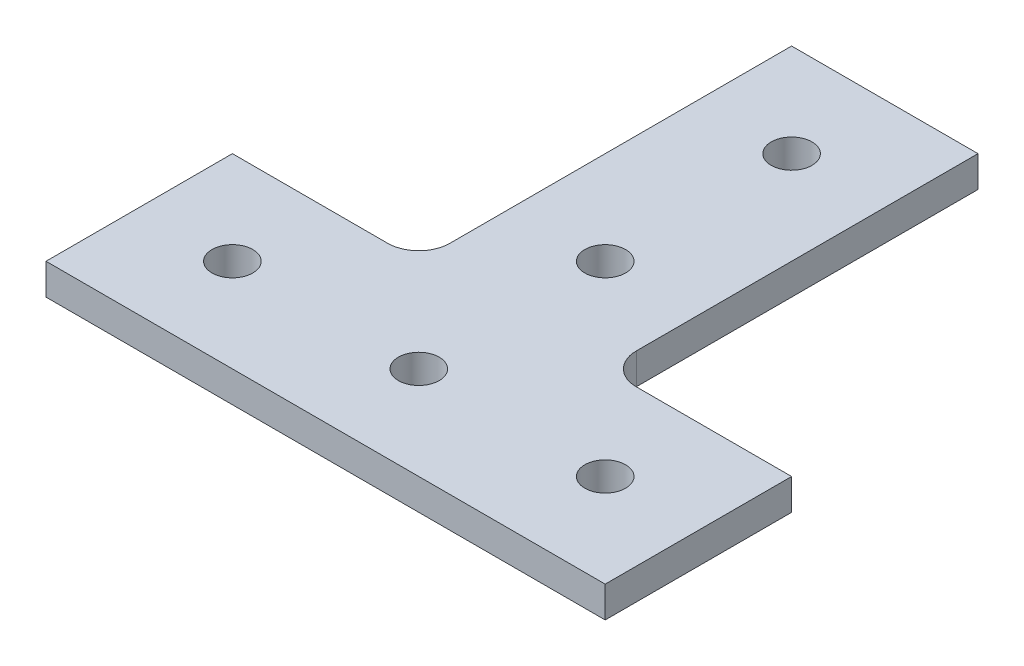
ISO-10303-21;
HEADER;
FILE_DESCRIPTION(('STEP AP214'),'2;1');
FILE_NAME('part.step','',(''),(''),'','','');
FILE_SCHEMA(('AUTOMOTIVE_DESIGN { 1 0 10303 214 1 1 1 1 }'));
ENDSEC;
DATA;
#1=APPLICATION_CONTEXT('core data for automotive mechanical design processes');
#2=APPLICATION_PROTOCOL_DEFINITION('international standard','automotive_design',2000,#1);
#3=PRODUCT_CONTEXT('',#1,'mechanical');
#4=PRODUCT('Part','Part','',(#3));
#5=PRODUCT_RELATED_PRODUCT_CATEGORY('part','',(#4));
#6=PRODUCT_DEFINITION_FORMATION('','',#4);
#7=PRODUCT_DEFINITION_CONTEXT('part definition',#1,'design');
#8=PRODUCT_DEFINITION('design','',#6,#7);
#9=PRODUCT_DEFINITION_SHAPE('','',#8);
#10=(LENGTH_UNIT() NAMED_UNIT(*) SI_UNIT(.MILLI.,.METRE.));
#11=(NAMED_UNIT(*) PLANE_ANGLE_UNIT() SI_UNIT($,.RADIAN.));
#12=(NAMED_UNIT(*) SI_UNIT($,.STERADIAN.) SOLID_ANGLE_UNIT());
#13=UNCERTAINTY_MEASURE_WITH_UNIT(LENGTH_MEASURE(1.E-05),#10,'distance_accuracy_value','');
#14=(GEOMETRIC_REPRESENTATION_CONTEXT(3) GLOBAL_UNCERTAINTY_ASSIGNED_CONTEXT((#13)) GLOBAL_UNIT_ASSIGNED_CONTEXT((#10,
#11,#12)) REPRESENTATION_CONTEXT('',''));
#15=CARTESIAN_POINT('',(0.,0.,0.));
#16=DIRECTION('',(0.,0.,1.));
#17=DIRECTION('',(1.,0.,0.));
#18=AXIS2_PLACEMENT_3D('',#15,#16,#17);
#19=CARTESIAN_POINT('',(-45.4735820895522,6.35,-26.8216417910448));
#20=DIRECTION('',(0.,1.,0.));
#21=DIRECTION('',(0.,0.,1.));
#22=AXIS2_PLACEMENT_3D('',#19,#20,#21);
#23=PLANE('',#22);
#24=CARTESIAN_POINT('',(18.0264179104478,6.35,-1.4216417910448));
#25=DIRECTION('',(0.,1.,0.));
#26=DIRECTION('',(0.,0.,1.));
#27=AXIS2_PLACEMENT_3D('',#24,#25,#26);
#28=CIRCLE('',#27,4.1656);
#29=CARTESIAN_POINT('',(18.0264179104478,6.35,2.7439582089552));
#30=VERTEX_POINT('',#29);
#31=EDGE_CURVE('E265',#30,#30,#28,.T.);
#32=ORIENTED_EDGE('',*,*,#31,.F.);
#33=EDGE_LOOP('',(#32));
#34=FACE_BOUND('',#33,.T.);
#35=CARTESIAN_POINT('',(-20.0735820895522,6.35,-1.42164179104477));
#36=DIRECTION('',(0.,1.,0.));
#37=DIRECTION('',(0.,0.,1.));
#38=AXIS2_PLACEMENT_3D('',#35,#36,#37);
#39=CIRCLE('',#38,4.1656);
#40=CARTESIAN_POINT('',(-20.0735820895522,6.35,2.74395820895523));
#41=VERTEX_POINT('',#40);
#42=EDGE_CURVE('E249',#41,#41,#39,.T.);
#43=ORIENTED_EDGE('',*,*,#42,.F.);
#44=EDGE_LOOP('',(#43));
#45=FACE_BOUND('',#44,.T.);
#46=DIRECTION('',(1.,0.,0.));
#47=VECTOR('',#46,1.);
#48=CARTESIAN_POINT('',(37.0764179104478,6.35,17.6283582089552));
#49=LINE('',#48,#47);
#50=CARTESIAN_POINT('',(-77.2235820895522,6.35,17.6283582089552));
#51=VERTEX_POINT('',#50);
#52=CARTESIAN_POINT('',(37.0764179104478,6.35,17.6283582089552));
#53=VERTEX_POINT('',#52);
#54=EDGE_CURVE('E182',#51,#53,#49,.T.);
#55=ORIENTED_EDGE('',*,*,#54,.T.);
#56=DIRECTION('',(0.,0.,-1.));
#57=VECTOR('',#56,1.);
#58=CARTESIAN_POINT('',(37.0764179104478,6.35,-20.4716417910448));
#59=LINE('',#58,#57);
#60=CARTESIAN_POINT('',(37.0764179104478,6.35,-20.4716417910448));
#61=VERTEX_POINT('',#60);
#62=EDGE_CURVE('E106',#53,#61,#59,.T.);
#63=ORIENTED_EDGE('',*,*,#62,.T.);
#64=DIRECTION('',(-1.,0.,0.));
#65=VECTOR('',#64,1.);
#66=CARTESIAN_POINT('',(5.32641791044777,6.35,-20.4716417910448));
#67=LINE('',#66,#65);
#68=CARTESIAN_POINT('',(5.32641791044777,6.35,-20.4716417910448));
#69=VERTEX_POINT('',#68);
#70=EDGE_CURVE('E211',#61,#69,#67,.T.);
#71=ORIENTED_EDGE('',*,*,#70,.T.);
#72=CARTESIAN_POINT('',(5.32641791044777,6.35,-26.8216417910448));
#73=DIRECTION('',(0.,-1.,0.));
#74=DIRECTION('',(0.,0.,-1.));
#75=AXIS2_PLACEMENT_3D('',#72,#73,#74);
#76=CIRCLE('',#75,6.35);
#77=CARTESIAN_POINT('',(-1.02358208955223,6.35,-26.8216417910448));
#78=VERTEX_POINT('',#77);
#79=EDGE_CURVE('E231',#69,#78,#76,.T.);
#80=ORIENTED_EDGE('',*,*,#79,.T.);
#81=DIRECTION('',(0.,0.,-1.));
#82=VECTOR('',#81,1.);
#83=CARTESIAN_POINT('',(-1.02358208955224,6.35,-96.6716417910448));
#84=LINE('',#83,#82);
#85=CARTESIAN_POINT('',(-1.02358208955224,6.35,-96.6716417910448));
#86=VERTEX_POINT('',#85);
#87=EDGE_CURVE('E227',#78,#86,#84,.T.);
#88=ORIENTED_EDGE('',*,*,#87,.T.);
#89=DIRECTION('',(-1.,0.,0.));
#90=VECTOR('',#89,1.);
#91=CARTESIAN_POINT('',(-39.1235820895522,6.35,-96.6716417910448));
#92=LINE('',#91,#90);
#93=CARTESIAN_POINT('',(-39.1235820895522,6.35,-96.6716417910448));
#94=VERTEX_POINT('',#93);
#95=EDGE_CURVE('E230',#86,#94,#92,.T.);
#96=ORIENTED_EDGE('',*,*,#95,.T.);
#97=DIRECTION('',(0.,0.,1.));
#98=VECTOR('',#97,1.);
#99=CARTESIAN_POINT('',(-39.1235820895522,6.35,-26.8216417910448));
#100=LINE('',#99,#98);
#101=CARTESIAN_POINT('',(-39.1235820895522,6.35,-26.8216417910448));
#102=VERTEX_POINT('',#101);
#103=EDGE_CURVE('E131',#94,#102,#100,.T.);
#104=ORIENTED_EDGE('',*,*,#103,.T.);
#105=CARTESIAN_POINT('',(-45.4735820895522,6.35,-26.8216417910448));
#106=DIRECTION('',(0.,-1.,0.));
#107=DIRECTION('',(0.,0.,1.));
#108=AXIS2_PLACEMENT_3D('',#105,#106,#107);
#109=CIRCLE('',#108,6.35);
#110=CARTESIAN_POINT('',(-45.4735820895523,6.35,-20.4716417910448));
#111=VERTEX_POINT('',#110);
#112=EDGE_CURVE('E125',#102,#111,#109,.T.);
#113=ORIENTED_EDGE('',*,*,#112,.T.);
#114=DIRECTION('',(-1.,0.,0.));
#115=VECTOR('',#114,1.);
#116=CARTESIAN_POINT('',(-77.2235820895522,6.35,-20.4716417910448));
#117=LINE('',#116,#115);
#118=CARTESIAN_POINT('',(-77.2235820895522,6.35,-20.4716417910448));
#119=VERTEX_POINT('',#118);
#120=EDGE_CURVE('E129',#111,#119,#117,.T.);
#121=ORIENTED_EDGE('',*,*,#120,.T.);
#122=DIRECTION('',(0.,0.,1.));
#123=VECTOR('',#122,1.);
#124=CARTESIAN_POINT('',(-77.2235820895522,6.35,17.6283582089552));
#125=LINE('',#124,#123);
#126=EDGE_CURVE('E57',#119,#51,#125,.T.);
#127=ORIENTED_EDGE('',*,*,#126,.T.);
#128=EDGE_LOOP('',(#55,#63,#71,#80,#88,#96,#104,#113,#121,#127));
#129=FACE_BOUND('',#128,.T.);
#130=CARTESIAN_POINT('',(-20.0735820895522,6.35,-77.6216417910448));
#131=DIRECTION('',(0.,1.,0.));
#132=DIRECTION('',(0.,0.,1.));
#133=AXIS2_PLACEMENT_3D('',#130,#131,#132);
#134=CIRCLE('',#133,4.16560000000001);
#135=CARTESIAN_POINT('',(-20.0735820895522,6.35,-73.4560417910448));
#136=VERTEX_POINT('',#135);
#137=EDGE_CURVE('E158',#136,#136,#134,.T.);
#138=ORIENTED_EDGE('',*,*,#137,.F.);
#139=EDGE_LOOP('',(#138));
#140=FACE_BOUND('',#139,.T.);
#141=CARTESIAN_POINT('',(-20.0735820895522,6.35,-39.5216417910448));
#142=DIRECTION('',(0.,1.,0.));
#143=DIRECTION('',(0.,0.,1.));
#144=AXIS2_PLACEMENT_3D('',#141,#142,#143);
#145=CIRCLE('',#144,4.1656);
#146=CARTESIAN_POINT('',(-20.0735820895522,6.35,-35.3560417910448));
#147=VERTEX_POINT('',#146);
#148=EDGE_CURVE('E257',#147,#147,#145,.T.);
#149=ORIENTED_EDGE('',*,*,#148,.F.);
#150=EDGE_LOOP('',(#149));
#151=FACE_BOUND('',#150,.T.);
#152=CARTESIAN_POINT('',(-58.1735820895522,6.35,-1.42164179104477));
#153=DIRECTION('',(0.,1.,0.));
#154=DIRECTION('',(0.,0.,1.));
#155=AXIS2_PLACEMENT_3D('',#152,#153,#154);
#156=CIRCLE('',#155,4.1656);
#157=CARTESIAN_POINT('',(-58.1735820895522,6.35,2.74395820895523));
#158=VERTEX_POINT('',#157);
#159=EDGE_CURVE('E273',#158,#158,#156,.T.);
#160=ORIENTED_EDGE('',*,*,#159,.F.);
#161=EDGE_LOOP('',(#160));
#162=FACE_BOUND('',#161,.T.);
#163=ADVANCED_FACE('F39',(#34,#45,#129,#140,#151,#162),#23,.T.);
#164=CARTESIAN_POINT('',(-45.4735820895522,0.,-26.8216417910448));
#165=DIRECTION('',(0.,1.,0.));
#166=DIRECTION('',(0.,0.,1.));
#167=AXIS2_PLACEMENT_3D('',#164,#165,#166);
#168=PLANE('',#167);
#169=DIRECTION('',(1.,0.,0.));
#170=VECTOR('',#169,1.);
#171=CARTESIAN_POINT('',(37.0764179104478,0.,17.6283582089552));
#172=LINE('',#171,#170);
#173=CARTESIAN_POINT('',(-77.2235820895522,0.,17.6283582089552));
#174=VERTEX_POINT('',#173);
#175=CARTESIAN_POINT('',(37.0764179104478,0.,17.6283582089552));
#176=VERTEX_POINT('',#175);
#177=EDGE_CURVE('E153',#174,#176,#172,.T.);
#178=ORIENTED_EDGE('',*,*,#177,.F.);
#179=DIRECTION('',(0.,0.,1.));
#180=VECTOR('',#179,1.);
#181=CARTESIAN_POINT('',(-77.2235820895522,0.,17.6283582089552));
#182=LINE('',#181,#180);
#183=CARTESIAN_POINT('',(-77.2235820895522,0.,-20.4716417910448));
#184=VERTEX_POINT('',#183);
#185=EDGE_CURVE('E98',#184,#174,#182,.T.);
#186=ORIENTED_EDGE('',*,*,#185,.F.);
#187=DIRECTION('',(-1.,0.,0.));
#188=VECTOR('',#187,1.);
#189=CARTESIAN_POINT('',(-77.2235820895522,0.,-20.4716417910448));
#190=LINE('',#189,#188);
#191=CARTESIAN_POINT('',(-45.4735820895523,0.,-20.4716417910448));
#192=VERTEX_POINT('',#191);
#193=EDGE_CURVE('E92',#192,#184,#190,.T.);
#194=ORIENTED_EDGE('',*,*,#193,.F.);
#195=CARTESIAN_POINT('',(-45.4735820895522,0.,-26.8216417910448));
#196=DIRECTION('',(0.,-1.,0.));
#197=DIRECTION('',(0.,0.,1.));
#198=AXIS2_PLACEMENT_3D('',#195,#196,#197);
#199=CIRCLE('',#198,6.35);
#200=CARTESIAN_POINT('',(-39.1235820895522,0.,-26.8216417910448));
#201=VERTEX_POINT('',#200);
#202=EDGE_CURVE('E140',#201,#192,#199,.T.);
#203=ORIENTED_EDGE('',*,*,#202,.F.);
#204=DIRECTION('',(0.,0.,1.));
#205=VECTOR('',#204,1.);
#206=CARTESIAN_POINT('',(-39.1235820895522,0.,-26.8216417910448));
#207=LINE('',#206,#205);
#208=CARTESIAN_POINT('',(-39.1235820895522,0.,-96.6716417910448));
#209=VERTEX_POINT('',#208);
#210=EDGE_CURVE('E173',#209,#201,#207,.T.);
#211=ORIENTED_EDGE('',*,*,#210,.F.);
#212=DIRECTION('',(-1.,0.,0.));
#213=VECTOR('',#212,1.);
#214=CARTESIAN_POINT('',(-39.1235820895522,0.,-96.6716417910448));
#215=LINE('',#214,#213);
#216=CARTESIAN_POINT('',(-1.02358208955224,0.,-96.6716417910448));
#217=VERTEX_POINT('',#216);
#218=EDGE_CURVE('E170',#217,#209,#215,.T.);
#219=ORIENTED_EDGE('',*,*,#218,.F.);
#220=DIRECTION('',(0.,0.,-1.));
#221=VECTOR('',#220,1.);
#222=CARTESIAN_POINT('',(-1.02358208955224,0.,-96.6716417910448));
#223=LINE('',#222,#221);
#224=CARTESIAN_POINT('',(-1.02358208955223,0.,-26.8216417910448));
#225=VERTEX_POINT('',#224);
#226=EDGE_CURVE('E167',#225,#217,#223,.T.);
#227=ORIENTED_EDGE('',*,*,#226,.F.);
#228=CARTESIAN_POINT('',(5.32641791044777,0.,-26.8216417910448));
#229=DIRECTION('',(0.,-1.,0.));
#230=DIRECTION('',(0.,0.,-1.));
#231=AXIS2_PLACEMENT_3D('',#228,#229,#230);
#232=CIRCLE('',#231,6.35);
#233=CARTESIAN_POINT('',(5.32641791044777,0.,-20.4716417910448));
#234=VERTEX_POINT('',#233);
#235=EDGE_CURVE('E164',#234,#225,#232,.T.);
#236=ORIENTED_EDGE('',*,*,#235,.F.);
#237=DIRECTION('',(-1.,0.,0.));
#238=VECTOR('',#237,1.);
#239=CARTESIAN_POINT('',(5.32641791044777,0.,-20.4716417910448));
#240=LINE('',#239,#238);
#241=CARTESIAN_POINT('',(37.0764179104478,0.,-20.4716417910448));
#242=VERTEX_POINT('',#241);
#243=EDGE_CURVE('E161',#242,#234,#240,.T.);
#244=ORIENTED_EDGE('',*,*,#243,.F.);
#245=DIRECTION('',(0.,0.,-1.));
#246=VECTOR('',#245,1.);
#247=CARTESIAN_POINT('',(37.0764179104478,0.,-20.4716417910448));
#248=LINE('',#247,#246);
#249=EDGE_CURVE('E157',#176,#242,#248,.T.);
#250=ORIENTED_EDGE('',*,*,#249,.F.);
#251=EDGE_LOOP('',(#178,#186,#194,#203,#211,#219,#227,#236,#244,#250));
#252=FACE_BOUND('',#251,.T.);
#253=CARTESIAN_POINT('',(-20.0735820895522,0.,-77.6216417910448));
#254=DIRECTION('',(0.,1.,0.));
#255=DIRECTION('',(0.,0.,1.));
#256=AXIS2_PLACEMENT_3D('',#253,#254,#255);
#257=CIRCLE('',#256,4.16560000000001);
#258=CARTESIAN_POINT('',(-20.0735820895522,0.,-73.4560417910448));
#259=VERTEX_POINT('',#258);
#260=EDGE_CURVE('E245',#259,#259,#257,.T.);
#261=ORIENTED_EDGE('',*,*,#260,.T.);
#262=EDGE_LOOP('',(#261));
#263=FACE_BOUND('',#262,.T.);
#264=CARTESIAN_POINT('',(-20.0735820895522,0.,-1.42164179104477));
#265=DIRECTION('',(0.,1.,0.));
#266=DIRECTION('',(0.,0.,1.));
#267=AXIS2_PLACEMENT_3D('',#264,#265,#266);
#268=CIRCLE('',#267,4.1656);
#269=CARTESIAN_POINT('',(-20.0735820895522,0.,2.74395820895523));
#270=VERTEX_POINT('',#269);
#271=EDGE_CURVE('E253',#270,#270,#268,.T.);
#272=ORIENTED_EDGE('',*,*,#271,.T.);
#273=EDGE_LOOP('',(#272));
#274=FACE_BOUND('',#273,.T.);
#275=CARTESIAN_POINT('',(-20.0735820895522,0.,-39.5216417910448));
#276=DIRECTION('',(0.,1.,0.));
#277=DIRECTION('',(0.,0.,1.));
#278=AXIS2_PLACEMENT_3D('',#275,#276,#277);
#279=CIRCLE('',#278,4.1656);
#280=CARTESIAN_POINT('',(-20.0735820895522,0.,-35.3560417910448));
#281=VERTEX_POINT('',#280);
#282=EDGE_CURVE('E261',#281,#281,#279,.T.);
#283=ORIENTED_EDGE('',*,*,#282,.T.);
#284=EDGE_LOOP('',(#283));
#285=FACE_BOUND('',#284,.T.);
#286=CARTESIAN_POINT('',(18.0264179104478,0.,-1.4216417910448));
#287=DIRECTION('',(0.,1.,0.));
#288=DIRECTION('',(0.,0.,1.));
#289=AXIS2_PLACEMENT_3D('',#286,#287,#288);
#290=CIRCLE('',#289,4.1656);
#291=CARTESIAN_POINT('',(18.0264179104478,0.,2.7439582089552));
#292=VERTEX_POINT('',#291);
#293=EDGE_CURVE('E269',#292,#292,#290,.T.);
#294=ORIENTED_EDGE('',*,*,#293,.T.);
#295=EDGE_LOOP('',(#294));
#296=FACE_BOUND('',#295,.T.);
#297=CARTESIAN_POINT('',(-58.1735820895522,0.,-1.42164179104477));
#298=DIRECTION('',(0.,1.,0.));
#299=DIRECTION('',(0.,0.,1.));
#300=AXIS2_PLACEMENT_3D('',#297,#298,#299);
#301=CIRCLE('',#300,4.1656);
#302=CARTESIAN_POINT('',(-58.1735820895522,0.,2.74395820895523));
#303=VERTEX_POINT('',#302);
#304=EDGE_CURVE('E277',#303,#303,#301,.T.);
#305=ORIENTED_EDGE('',*,*,#304,.T.);
#306=EDGE_LOOP('',(#305));
#307=FACE_BOUND('',#306,.T.);
#308=ADVANCED_FACE('F215',(#252,#263,#274,#285,#296,#307),#168,.F.);
#309=CARTESIAN_POINT('',(37.0764179104478,6.35,17.6283582089552));
#310=DIRECTION('',(0.,0.,-1.));
#311=DIRECTION('',(-1.,0.,0.));
#312=AXIS2_PLACEMENT_3D('',#309,#310,#311);
#313=PLANE('',#312);
#314=ORIENTED_EDGE('',*,*,#177,.T.);
#315=DIRECTION('',(0.,-1.,0.));
#316=VECTOR('',#315,1.);
#317=CARTESIAN_POINT('',(37.0764179104478,6.35,17.6283582089552));
#318=LINE('',#317,#316);
#319=EDGE_CURVE('E11',#53,#176,#318,.T.);
#320=ORIENTED_EDGE('',*,*,#319,.F.);
#321=ORIENTED_EDGE('',*,*,#54,.F.);
#322=DIRECTION('',(0.,-1.,0.));
#323=VECTOR('',#322,1.);
#324=CARTESIAN_POINT('',(-77.2235820895522,6.35,17.6283582089552));
#325=LINE('',#324,#323);
#326=EDGE_CURVE('E149',#51,#174,#325,.T.);
#327=ORIENTED_EDGE('',*,*,#326,.T.);
#328=EDGE_LOOP('',(#314,#320,#321,#327));
#329=FACE_BOUND('',#328,.T.);
#330=ADVANCED_FACE('F41',(#329),#313,.F.);
#331=CARTESIAN_POINT('',(37.0764179104478,6.35,-20.4716417910448));
#332=DIRECTION('',(-1.,0.,0.));
#333=DIRECTION('',(0.,0.,1.));
#334=AXIS2_PLACEMENT_3D('',#331,#332,#333);
#335=PLANE('',#334);
#336=ORIENTED_EDGE('',*,*,#249,.T.);
#337=DIRECTION('',(0.,-1.,0.));
#338=VECTOR('',#337,1.);
#339=CARTESIAN_POINT('',(37.0764179104478,6.35,-20.4716417910448));
#340=LINE('',#339,#338);
#341=EDGE_CURVE('E49',#61,#242,#340,.T.);
#342=ORIENTED_EDGE('',*,*,#341,.F.);
#343=ORIENTED_EDGE('',*,*,#62,.F.);
#344=ORIENTED_EDGE('',*,*,#319,.T.);
#345=EDGE_LOOP('',(#336,#342,#343,#344));
#346=FACE_BOUND('',#345,.T.);
#347=ADVANCED_FACE('F321',(#346),#335,.F.);
#348=CARTESIAN_POINT('',(5.32641791044777,6.35,-20.4716417910448));
#349=DIRECTION('',(0.,0.,1.));
#350=DIRECTION('',(1.,0.,0.));
#351=AXIS2_PLACEMENT_3D('',#348,#349,#350);
#352=PLANE('',#351);
#353=ORIENTED_EDGE('',*,*,#243,.T.);
#354=DIRECTION('',(0.,-1.,0.));
#355=VECTOR('',#354,1.);
#356=CARTESIAN_POINT('',(5.32641791044777,6.35,-20.4716417910448));
#357=LINE('',#356,#355);
#358=EDGE_CURVE('E201',#69,#234,#357,.T.);
#359=ORIENTED_EDGE('',*,*,#358,.F.);
#360=ORIENTED_EDGE('',*,*,#70,.F.);
#361=ORIENTED_EDGE('',*,*,#341,.T.);
#362=EDGE_LOOP('',(#353,#359,#360,#361));
#363=FACE_BOUND('',#362,.T.);
#364=ADVANCED_FACE('F209',(#363),#352,.F.);
#365=CARTESIAN_POINT('',(5.32641791044777,6.35,-26.8216417910448));
#366=DIRECTION('',(0.,-1.,0.));
#367=DIRECTION('',(0.,0.,-1.));
#368=AXIS2_PLACEMENT_3D('',#365,#366,#367);
#369=CYLINDRICAL_SURFACE('',#368,6.35);
#370=ORIENTED_EDGE('',*,*,#235,.T.);
#371=DIRECTION('',(0.,-1.,0.));
#372=VECTOR('',#371,1.);
#373=CARTESIAN_POINT('',(-1.02358208955223,6.35,-26.8216417910448));
#374=LINE('',#373,#372);
#375=EDGE_CURVE('E197',#78,#225,#374,.T.);
#376=ORIENTED_EDGE('',*,*,#375,.F.);
#377=ORIENTED_EDGE('',*,*,#79,.F.);
#378=ORIENTED_EDGE('',*,*,#358,.T.);
#379=EDGE_LOOP('',(#370,#376,#377,#378));
#380=FACE_BOUND('',#379,.T.);
#381=ADVANCED_FACE('F221',(#380),#369,.F.);
#382=CARTESIAN_POINT('',(-1.02358208955224,6.35,-96.6716417910448));
#383=DIRECTION('',(-1.,0.,0.));
#384=DIRECTION('',(0.,0.,1.));
#385=AXIS2_PLACEMENT_3D('',#382,#383,#384);
#386=PLANE('',#385);
#387=ORIENTED_EDGE('',*,*,#226,.T.);
#388=DIRECTION('',(0.,-1.,0.));
#389=VECTOR('',#388,1.);
#390=CARTESIAN_POINT('',(-1.02358208955224,6.35,-96.6716417910448));
#391=LINE('',#390,#389);
#392=EDGE_CURVE('E193',#86,#217,#391,.T.);
#393=ORIENTED_EDGE('',*,*,#392,.F.);
#394=ORIENTED_EDGE('',*,*,#87,.F.);
#395=ORIENTED_EDGE('',*,*,#375,.T.);
#396=EDGE_LOOP('',(#387,#393,#394,#395));
#397=FACE_BOUND('',#396,.T.);
#398=ADVANCED_FACE('F225',(#397),#386,.F.);
#399=CARTESIAN_POINT('',(-39.1235820895522,6.35,-96.6716417910448));
#400=DIRECTION('',(0.,0.,1.));
#401=DIRECTION('',(1.,0.,0.));
#402=AXIS2_PLACEMENT_3D('',#399,#400,#401);
#403=PLANE('',#402);
#404=ORIENTED_EDGE('',*,*,#218,.T.);
#405=DIRECTION('',(0.,-1.,0.));
#406=VECTOR('',#405,1.);
#407=CARTESIAN_POINT('',(-39.1235820895522,6.35,-96.6716417910448));
#408=LINE('',#407,#406);
#409=EDGE_CURVE('E189',#94,#209,#408,.T.);
#410=ORIENTED_EDGE('',*,*,#409,.F.);
#411=ORIENTED_EDGE('',*,*,#95,.F.);
#412=ORIENTED_EDGE('',*,*,#392,.T.);
#413=EDGE_LOOP('',(#404,#410,#411,#412));
#414=FACE_BOUND('',#413,.T.);
#415=ADVANCED_FACE('F311',(#414),#403,.F.);
#416=CARTESIAN_POINT('',(-39.1235820895522,6.35,-26.8216417910448));
#417=DIRECTION('',(1.,0.,0.));
#418=DIRECTION('',(0.,0.,-1.));
#419=AXIS2_PLACEMENT_3D('',#416,#417,#418);
#420=PLANE('',#419);
#421=ORIENTED_EDGE('',*,*,#210,.T.);
#422=DIRECTION('',(0.,-1.,0.));
#423=VECTOR('',#422,1.);
#424=CARTESIAN_POINT('',(-39.1235820895522,6.35,-26.8216417910448));
#425=LINE('',#424,#423);
#426=EDGE_CURVE('E142',#102,#201,#425,.T.);
#427=ORIENTED_EDGE('',*,*,#426,.F.);
#428=ORIENTED_EDGE('',*,*,#103,.F.);
#429=ORIENTED_EDGE('',*,*,#409,.T.);
#430=EDGE_LOOP('',(#421,#427,#428,#429));
#431=FACE_BOUND('',#430,.T.);
#432=ADVANCED_FACE('F308',(#431),#420,.F.);
#433=CARTESIAN_POINT('',(-45.4735820895522,6.35,-26.8216417910448));
#434=DIRECTION('',(0.,-1.,0.));
#435=DIRECTION('',(0.,0.,-1.));
#436=AXIS2_PLACEMENT_3D('',#433,#434,#435);
#437=CYLINDRICAL_SURFACE('',#436,6.35);
#438=ORIENTED_EDGE('',*,*,#202,.T.);
#439=DIRECTION('',(0.,-1.,0.));
#440=VECTOR('',#439,1.);
#441=CARTESIAN_POINT('',(-45.4735820895523,6.35,-20.4716417910448));
#442=LINE('',#441,#440);
#443=EDGE_CURVE('E137',#111,#192,#442,.T.);
#444=ORIENTED_EDGE('',*,*,#443,.F.);
#445=ORIENTED_EDGE('',*,*,#112,.F.);
#446=ORIENTED_EDGE('',*,*,#426,.T.);
#447=EDGE_LOOP('',(#438,#444,#445,#446));
#448=FACE_BOUND('',#447,.T.);
#449=ADVANCED_FACE('F138',(#448),#437,.F.);
#450=CARTESIAN_POINT('',(-77.2235820895522,6.35,-20.4716417910448));
#451=DIRECTION('',(0.,0.,1.));
#452=DIRECTION('',(1.,0.,0.));
#453=AXIS2_PLACEMENT_3D('',#450,#451,#452);
#454=PLANE('',#453);
#455=ORIENTED_EDGE('',*,*,#193,.T.);
#456=DIRECTION('',(0.,-1.,0.));
#457=VECTOR('',#456,1.);
#458=CARTESIAN_POINT('',(-77.2235820895522,6.35,-20.4716417910448));
#459=LINE('',#458,#457);
#460=EDGE_CURVE('E143',#119,#184,#459,.T.);
#461=ORIENTED_EDGE('',*,*,#460,.F.);
#462=ORIENTED_EDGE('',*,*,#120,.F.);
#463=ORIENTED_EDGE('',*,*,#443,.T.);
#464=EDGE_LOOP('',(#455,#461,#462,#463));
#465=FACE_BOUND('',#464,.T.);
#466=ADVANCED_FACE('F145',(#465),#454,.F.);
#467=CARTESIAN_POINT('',(-77.2235820895522,6.35,17.6283582089552));
#468=DIRECTION('',(1.,0.,0.));
#469=DIRECTION('',(0.,0.,-1.));
#470=AXIS2_PLACEMENT_3D('',#467,#468,#469);
#471=PLANE('',#470);
#472=ORIENTED_EDGE('',*,*,#185,.T.);
#473=ORIENTED_EDGE('',*,*,#326,.F.);
#474=ORIENTED_EDGE('',*,*,#126,.F.);
#475=ORIENTED_EDGE('',*,*,#460,.T.);
#476=EDGE_LOOP('',(#472,#473,#474,#475));
#477=FACE_BOUND('',#476,.T.);
#478=ADVANCED_FACE('F301',(#477),#471,.F.);
#479=CARTESIAN_POINT('',(-20.0735820895522,6.35,-77.6216417910448));
#480=DIRECTION('',(0.,-1.,0.));
#481=DIRECTION('',(0.,0.,-1.));
#482=AXIS2_PLACEMENT_3D('',#479,#480,#481);
#483=CYLINDRICAL_SURFACE('',#482,4.16560000000001);
#484=ORIENTED_EDGE('',*,*,#137,.T.);
#485=EDGE_LOOP('',(#484));
#486=FACE_BOUND('',#485,.T.);
#487=ORIENTED_EDGE('',*,*,#260,.F.);
#488=EDGE_LOOP('',(#487));
#489=FACE_BOUND('',#488,.T.);
#490=ADVANCED_FACE('F298',(#486,#489),#483,.F.);
#491=CARTESIAN_POINT('',(-20.0735820895522,6.35,-1.42164179104477));
#492=DIRECTION('',(0.,-1.,0.));
#493=DIRECTION('',(0.,0.,-1.));
#494=AXIS2_PLACEMENT_3D('',#491,#492,#493);
#495=CYLINDRICAL_SURFACE('',#494,4.1656);
#496=ORIENTED_EDGE('',*,*,#42,.T.);
#497=EDGE_LOOP('',(#496));
#498=FACE_BOUND('',#497,.T.);
#499=ORIENTED_EDGE('',*,*,#271,.F.);
#500=EDGE_LOOP('',(#499));
#501=FACE_BOUND('',#500,.T.);
#502=ADVANCED_FACE('F397',(#498,#501),#495,.F.);
#503=CARTESIAN_POINT('',(-20.0735820895522,6.35,-39.5216417910448));
#504=DIRECTION('',(0.,-1.,0.));
#505=DIRECTION('',(0.,0.,-1.));
#506=AXIS2_PLACEMENT_3D('',#503,#504,#505);
#507=CYLINDRICAL_SURFACE('',#506,4.1656);
#508=ORIENTED_EDGE('',*,*,#148,.T.);
#509=EDGE_LOOP('',(#508));
#510=FACE_BOUND('',#509,.T.);
#511=ORIENTED_EDGE('',*,*,#282,.F.);
#512=EDGE_LOOP('',(#511));
#513=FACE_BOUND('',#512,.T.);
#514=ADVANCED_FACE('F405',(#510,#513),#507,.F.);
#515=CARTESIAN_POINT('',(18.0264179104478,6.35,-1.4216417910448));
#516=DIRECTION('',(0.,-1.,0.));
#517=DIRECTION('',(0.,0.,-1.));
#518=AXIS2_PLACEMENT_3D('',#515,#516,#517);
#519=CYLINDRICAL_SURFACE('',#518,4.1656);
#520=ORIENTED_EDGE('',*,*,#31,.T.);
#521=EDGE_LOOP('',(#520));
#522=FACE_BOUND('',#521,.T.);
#523=ORIENTED_EDGE('',*,*,#293,.F.);
#524=EDGE_LOOP('',(#523));
#525=FACE_BOUND('',#524,.T.);
#526=ADVANCED_FACE('F413',(#522,#525),#519,.F.);
#527=CARTESIAN_POINT('',(-58.1735820895522,6.35,-1.42164179104477));
#528=DIRECTION('',(0.,-1.,0.));
#529=DIRECTION('',(0.,0.,-1.));
#530=AXIS2_PLACEMENT_3D('',#527,#528,#529);
#531=CYLINDRICAL_SURFACE('',#530,4.1656);
#532=ORIENTED_EDGE('',*,*,#159,.T.);
#533=EDGE_LOOP('',(#532));
#534=FACE_BOUND('',#533,.T.);
#535=ORIENTED_EDGE('',*,*,#304,.F.);
#536=EDGE_LOOP('',(#535));
#537=FACE_BOUND('',#536,.T.);
#538=ADVANCED_FACE('F285',(#534,#537),#531,.F.);
#539=CLOSED_SHELL('',(#163,#308,#330,#347,#364,#381,#398,#415,#432,#449,#466,#478,#490,#502,
#514,#526,#538));
#540=MANIFOLD_SOLID_BREP('B2',#539);
#541=ADVANCED_BREP_SHAPE_REPRESENTATION('',(#18,#540),#14);
#542=SHAPE_DEFINITION_REPRESENTATION(#9,#541);
ENDSEC;
END-ISO-10303-21;
